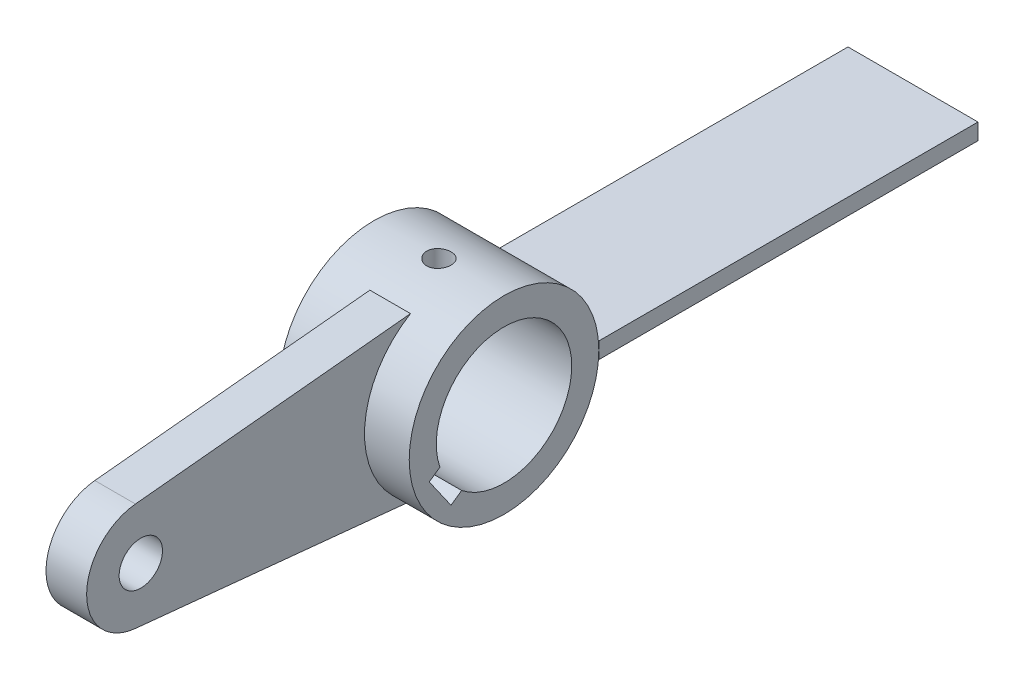
ISO-10303-21;
HEADER;
FILE_DESCRIPTION(('STEP AP214'),'2;1');
FILE_NAME('part.step','',(''),(''),'','','');
FILE_SCHEMA(('AUTOMOTIVE_DESIGN { 1 0 10303 214 1 1 1 1 }'));
ENDSEC;
DATA;
#1=APPLICATION_CONTEXT('core data for automotive mechanical design processes');
#2=APPLICATION_PROTOCOL_DEFINITION('international standard','automotive_design',2000,#1);
#3=PRODUCT_CONTEXT('',#1,'mechanical');
#4=PRODUCT('Part','Part','',(#3));
#5=PRODUCT_RELATED_PRODUCT_CATEGORY('part','',(#4));
#6=PRODUCT_DEFINITION_FORMATION('','',#4);
#7=PRODUCT_DEFINITION_CONTEXT('part definition',#1,'design');
#8=PRODUCT_DEFINITION('design','',#6,#7);
#9=PRODUCT_DEFINITION_SHAPE('','',#8);
#10=(LENGTH_UNIT() NAMED_UNIT(*) SI_UNIT(.MILLI.,.METRE.));
#11=(NAMED_UNIT(*) PLANE_ANGLE_UNIT() SI_UNIT($,.RADIAN.));
#12=(NAMED_UNIT(*) SI_UNIT($,.STERADIAN.) SOLID_ANGLE_UNIT());
#13=UNCERTAINTY_MEASURE_WITH_UNIT(LENGTH_MEASURE(1.E-05),#10,'distance_accuracy_value','');
#14=(GEOMETRIC_REPRESENTATION_CONTEXT(3) GLOBAL_UNCERTAINTY_ASSIGNED_CONTEXT((#13)) GLOBAL_UNIT_ASSIGNED_CONTEXT((#10,
#11,#12)) REPRESENTATION_CONTEXT('',''));
#15=CARTESIAN_POINT('',(0.,0.,0.));
#16=DIRECTION('',(0.,0.,1.));
#17=DIRECTION('',(1.,0.,0.));
#18=AXIS2_PLACEMENT_3D('',#15,#16,#17);
#19=CARTESIAN_POINT('',(23.9999999999994,-3.00000000000006,-175.));
#20=DIRECTION('',(1.,0.,0.));
#21=DIRECTION('',(0.,0.,-1.));
#22=AXIS2_PLACEMENT_3D('',#19,#20,#21);
#23=PLANE('',#22);
#24=DIRECTION('',(0.,1.,0.));
#25=VECTOR('',#24,1.);
#26=CARTESIAN_POINT('',(24.,-2.99999999999995,-35.0000000000001));
#27=LINE('',#26,#25);
#28=CARTESIAN_POINT('',(24.,-2.99999999999995,-35.0000000000001));
#29=VERTEX_POINT('',#28);
#30=CARTESIAN_POINT('',(24.,3.00000000000006,-35.0000000000001));
#31=VERTEX_POINT('',#30);
#32=EDGE_CURVE('E117',#29,#31,#27,.T.);
#33=ORIENTED_EDGE('',*,*,#32,.F.);
#34=DIRECTION('',(0.,0.,1.));
#35=VECTOR('',#34,1.);
#36=CARTESIAN_POINT('',(23.9999999999994,-3.00000000000006,-175.));
#37=LINE('',#36,#35);
#38=CARTESIAN_POINT('',(23.9999999999994,-3.00000000000006,-175.));
#39=VERTEX_POINT('',#38);
#40=EDGE_CURVE('E12',#39,#29,#37,.T.);
#41=ORIENTED_EDGE('',*,*,#40,.F.);
#42=DIRECTION('',(0.,1.,0.));
#43=VECTOR('',#42,1.);
#44=CARTESIAN_POINT('',(23.9999999999994,-3.00000000000006,-175.));
#45=LINE('',#44,#43);
#46=CARTESIAN_POINT('',(23.9999999999994,3.00000000000006,-175.));
#47=VERTEX_POINT('',#46);
#48=EDGE_CURVE('E111',#39,#47,#45,.T.);
#49=ORIENTED_EDGE('',*,*,#48,.T.);
#50=DIRECTION('',(0.,0.,1.));
#51=VECTOR('',#50,1.);
#52=CARTESIAN_POINT('',(23.9999999999994,3.00000000000006,-175.));
#53=LINE('',#52,#51);
#54=EDGE_CURVE('E56',#47,#31,#53,.T.);
#55=ORIENTED_EDGE('',*,*,#54,.T.);
#56=EDGE_LOOP('',(#33,#41,#49,#55));
#57=FACE_BOUND('',#56,.T.);
#58=ADVANCED_FACE('F53',(#57),#23,.T.);
#59=CARTESIAN_POINT('',(-24.0000000000007,-2.99999999999995,-175.));
#60=DIRECTION('',(0.,-1.,0.));
#61=DIRECTION('',(0.,0.,-1.));
#62=AXIS2_PLACEMENT_3D('',#59,#60,#61);
#63=PLANE('',#62);
#64=DIRECTION('',(1.,0.,0.));
#65=VECTOR('',#64,1.);
#66=CARTESIAN_POINT('',(-24.,-2.99999999999984,-35.));
#67=LINE('',#66,#65);
#68=CARTESIAN_POINT('',(-24.,-2.99999999999984,-35.));
#69=VERTEX_POINT('',#68);
#70=EDGE_CURVE('E113',#69,#29,#67,.T.);
#71=ORIENTED_EDGE('',*,*,#70,.F.);
#72=DIRECTION('',(0.,0.,1.));
#73=VECTOR('',#72,1.);
#74=CARTESIAN_POINT('',(-24.0000000000007,-2.99999999999995,-175.));
#75=LINE('',#74,#73);
#76=CARTESIAN_POINT('',(-24.0000000000007,-2.99999999999995,-175.));
#77=VERTEX_POINT('',#76);
#78=EDGE_CURVE('E62',#77,#69,#75,.T.);
#79=ORIENTED_EDGE('',*,*,#78,.F.);
#80=DIRECTION('',(1.,0.,0.));
#81=VECTOR('',#80,1.);
#82=CARTESIAN_POINT('',(-24.0000000000007,-2.99999999999995,-175.));
#83=LINE('',#82,#81);
#84=EDGE_CURVE('E108',#77,#39,#83,.T.);
#85=ORIENTED_EDGE('',*,*,#84,.T.);
#86=ORIENTED_EDGE('',*,*,#40,.T.);
#87=EDGE_LOOP('',(#71,#79,#85,#86));
#88=FACE_BOUND('',#87,.T.);
#89=ADVANCED_FACE('F127',(#88),#63,.T.);
#90=CARTESIAN_POINT('',(-24.0000000000007,-2.99999999999995,-175.));
#91=DIRECTION('',(-1.,0.,0.));
#92=DIRECTION('',(0.,0.,1.));
#93=AXIS2_PLACEMENT_3D('',#90,#91,#92);
#94=PLANE('',#93);
#95=DIRECTION('',(0.,-1.,0.));
#96=VECTOR('',#95,1.);
#97=CARTESIAN_POINT('',(-24.,-2.99999999999984,-35.));
#98=LINE('',#97,#96);
#99=CARTESIAN_POINT('',(-24.,3.00000000000017,-35.));
#100=VERTEX_POINT('',#99);
#101=EDGE_CURVE('E103',#100,#69,#98,.T.);
#102=ORIENTED_EDGE('',*,*,#101,.F.);
#103=DIRECTION('',(0.,0.,1.));
#104=VECTOR('',#103,1.);
#105=CARTESIAN_POINT('',(-24.0000000000007,3.00000000000022,-175.));
#106=LINE('',#105,#104);
#107=CARTESIAN_POINT('',(-24.0000000000007,3.00000000000022,-175.));
#108=VERTEX_POINT('',#107);
#109=EDGE_CURVE('E98',#108,#100,#106,.T.);
#110=ORIENTED_EDGE('',*,*,#109,.F.);
#111=DIRECTION('',(0.,-1.,0.));
#112=VECTOR('',#111,1.);
#113=CARTESIAN_POINT('',(-24.0000000000007,-2.99999999999995,-175.));
#114=LINE('',#113,#112);
#115=EDGE_CURVE('E101',#108,#77,#114,.T.);
#116=ORIENTED_EDGE('',*,*,#115,.T.);
#117=ORIENTED_EDGE('',*,*,#78,.T.);
#118=EDGE_LOOP('',(#102,#110,#116,#117));
#119=FACE_BOUND('',#118,.T.);
#120=ADVANCED_FACE('F100',(#119),#94,.T.);
#121=CARTESIAN_POINT('',(-24.0000000000007,3.00000000000022,-175.));
#122=DIRECTION('',(0.,1.,0.));
#123=DIRECTION('',(0.,0.,1.));
#124=AXIS2_PLACEMENT_3D('',#121,#122,#123);
#125=PLANE('',#124);
#126=DIRECTION('',(-1.,0.,0.));
#127=VECTOR('',#126,1.);
#128=CARTESIAN_POINT('',(-24.,3.00000000000017,-35.));
#129=LINE('',#128,#127);
#130=EDGE_CURVE('E120',#31,#100,#129,.T.);
#131=ORIENTED_EDGE('',*,*,#130,.F.);
#132=ORIENTED_EDGE('',*,*,#54,.F.);
#133=DIRECTION('',(-1.,0.,0.));
#134=VECTOR('',#133,1.);
#135=CARTESIAN_POINT('',(-24.0000000000007,3.00000000000022,-175.));
#136=LINE('',#135,#134);
#137=EDGE_CURVE('E107',#47,#108,#136,.T.);
#138=ORIENTED_EDGE('',*,*,#137,.T.);
#139=ORIENTED_EDGE('',*,*,#109,.T.);
#140=EDGE_LOOP('',(#131,#132,#138,#139));
#141=FACE_BOUND('',#140,.T.);
#142=ADVANCED_FACE('F110',(#141),#125,.T.);
#143=CARTESIAN_POINT('',(-6.66133814775094E-13,1.11022302462516E-13,-175.));
#144=DIRECTION('',(0.,0.,-1.));
#145=DIRECTION('',(-1.,0.,0.));
#146=AXIS2_PLACEMENT_3D('',#143,#144,#145);
#147=PLANE('',#146);
#148=ORIENTED_EDGE('',*,*,#48,.F.);
#149=ORIENTED_EDGE('',*,*,#84,.F.);
#150=ORIENTED_EDGE('',*,*,#115,.F.);
#151=ORIENTED_EDGE('',*,*,#137,.F.);
#152=EDGE_LOOP('',(#148,#149,#150,#151));
#153=FACE_BOUND('',#152,.T.);
#154=ADVANCED_FACE('F106',(#153),#147,.T.);
#155=CARTESIAN_POINT('',(0.,0.,-35.));
#156=DIRECTION('',(0.,0.,-1.));
#157=DIRECTION('',(-1.,0.,0.));
#158=AXIS2_PLACEMENT_3D('',#155,#156,#157);
#159=PLANE('',#158);
#160=ORIENTED_EDGE('',*,*,#32,.T.);
#161=ORIENTED_EDGE('',*,*,#130,.T.);
#162=ORIENTED_EDGE('',*,*,#101,.T.);
#163=ORIENTED_EDGE('',*,*,#70,.T.);
#164=EDGE_LOOP('',(#160,#161,#162,#163));
#165=FACE_BOUND('',#164,.T.);
#166=ADVANCED_FACE('F126',(#165),#159,.F.);
#167=CLOSED_SHELL('',(#58,#89,#120,#142,#154,#166));
#168=MANIFOLD_SOLID_BREP('B2',#167);
#169=CARTESIAN_POINT('',(24.,0.,0.));
#170=DIRECTION('',(-1.,0.,0.));
#171=DIRECTION('',(0.,0.,1.));
#172=AXIS2_PLACEMENT_3D('',#169,#170,#171);
#173=CYLINDRICAL_SURFACE('',#172,35.);
#174=DIRECTION('',(-1.,0.,0.));
#175=VECTOR('',#174,1.);
#176=CARTESIAN_POINT('',(7.4999999999994,30.0000000000001,18.02775637732));
#177=LINE('',#176,#175);
#178=CARTESIAN_POINT('',(7.4999999999994,30.0000000000001,18.02775637732));
#179=VERTEX_POINT('',#178);
#180=CARTESIAN_POINT('',(-7.50000000000051,30.,18.02775637732));
#181=VERTEX_POINT('',#180);
#182=EDGE_CURVE('E200',#179,#181,#177,.T.);
#183=ORIENTED_EDGE('',*,*,#182,.F.);
#184=CARTESIAN_POINT('',(7.50000000000006,1.66533453693773E-13,0.));
#185=DIRECTION('',(-1.,0.,0.));
#186=DIRECTION('',(0.,0.,-1.));
#187=AXIS2_PLACEMENT_3D('',#184,#185,#186);
#188=CIRCLE('',#187,35.);
#189=CARTESIAN_POINT('',(7.50000000000006,-29.9999999999999,18.02775637732));
#190=VERTEX_POINT('',#189);
#191=EDGE_CURVE('E282',#190,#179,#188,.T.);
#192=ORIENTED_EDGE('',*,*,#191,.F.);
#193=DIRECTION('',(-1.,0.,0.));
#194=VECTOR('',#193,1.);
#195=CARTESIAN_POINT('',(7.50000000000006,-29.9999999999999,18.02775637732));
#196=LINE('',#195,#194);
#197=CARTESIAN_POINT('',(-7.50000000000006,-30.,18.02775637732));
#198=VERTEX_POINT('',#197);
#199=EDGE_CURVE('E293',#190,#198,#196,.T.);
#200=ORIENTED_EDGE('',*,*,#199,.T.);
#201=CARTESIAN_POINT('',(-7.50000000000006,0.,0.));
#202=DIRECTION('',(-1.,0.,0.));
#203=DIRECTION('',(0.,0.,-1.));
#204=AXIS2_PLACEMENT_3D('',#201,#202,#203);
#205=CIRCLE('',#204,35.);
#206=EDGE_CURVE('E279',#198,#181,#205,.T.);
#207=ORIENTED_EDGE('',*,*,#206,.T.);
#208=EDGE_LOOP('',(#183,#192,#200,#207));
#209=FACE_BOUND('',#208,.T.);
#210=CARTESIAN_POINT('',(24.,0.,0.));
#211=DIRECTION('',(1.,0.,0.));
#212=DIRECTION('',(0.,0.,-1.));
#213=AXIS2_PLACEMENT_3D('',#210,#211,#212);
#214=CIRCLE('',#213,35.);
#215=CARTESIAN_POINT('',(24.,0.,-35.0000000000001));
#216=VERTEX_POINT('',#215);
#217=EDGE_CURVE('E314',#216,#216,#214,.T.);
#218=ORIENTED_EDGE('',*,*,#217,.F.);
#219=EDGE_LOOP('',(#218));
#220=FACE_BOUND('',#219,.T.);
#221=CARTESIAN_POINT('',(-24.,1.66533453693773E-13,0.));
#222=DIRECTION('',(1.,0.,0.));
#223=DIRECTION('',(0.,0.,-1.));
#224=AXIS2_PLACEMENT_3D('',#221,#222,#223);
#225=CIRCLE('',#224,35.);
#226=CARTESIAN_POINT('',(-24.,1.66533453693773E-13,-35.));
#227=VERTEX_POINT('',#226);
#228=EDGE_CURVE('E312',#227,#227,#225,.T.);
#229=ORIENTED_EDGE('',*,*,#228,.T.);
#230=EDGE_LOOP('',(#229));
#231=FACE_BOUND('',#230,.T.);
#232=CARTESIAN_POINT('',(-6.66133814775094E-13,34.7095087836173,4.5));
#233=CARTESIAN_POINT('',(0.251643636090625,34.7095124877344,4.49998933777102));
#234=CARTESIAN_POINT('',(0.503443077474984,34.7122749605346,4.47882058020246));
#235=CARTESIAN_POINT('',(1.00003007432827,34.7230217636267,4.39471133680819));
#236=CARTESIAN_POINT('',(1.24481009276557,34.7310115025031,4.33172758455312));
#237=CARTESIAN_POINT('',(1.72009682218295,34.751293244912,4.16587955190423));
#238=CARTESIAN_POINT('',(1.95061326011699,34.763582277653,4.0630428044678));
#239=CARTESIAN_POINT('',(2.39107558505762,34.7910743749605,3.82046770600752));
#240=CARTESIAN_POINT('',(2.60102488982105,34.806276954121,3.68073550042055));
#241=CARTESIAN_POINT('',(2.99567636291578,34.8379838512426,3.36745127394802));
#242=CARTESIAN_POINT('',(3.18023930111814,34.8544946215607,3.19372449492416));
#243=CARTESIAN_POINT('',(3.51767577864074,34.8868995891629,2.81775898128223));
#244=CARTESIAN_POINT('',(3.6705477202417,34.9027937553277,2.61551881000876));
#245=CARTESIAN_POINT('',(3.94076422813274,34.9322409256545,2.18738980575501));
#246=CARTESIAN_POINT('',(4.0579824668723,34.9457855337381,1.96142061365214));
#247=CARTESIAN_POINT('',(4.25275483563916,34.9689364819365,1.49280078764115));
#248=CARTESIAN_POINT('',(4.33031051955293,34.9785429763345,1.25015080767001));
#249=CARTESIAN_POINT('',(4.44313938142863,34.9926898511317,0.756482894207572));
#250=CARTESIAN_POINT('',(4.4786443093496,34.9972579892166,0.505518735850713));
#251=CARTESIAN_POINT('',(4.5070822128208,35.000908280569,0.00115558674675369));
#252=CARTESIAN_POINT('',(4.50001695462321,34.9999906614424,-0.252243302546962));
#253=CARTESIAN_POINT('',(4.44370039491123,34.9927952507115,-0.752705518540987));
#254=CARTESIAN_POINT('',(4.39469834536865,34.9865491298378,-0.99979741282101));
#255=CARTESIAN_POINT('',(4.25628903626044,34.9694340502021,-1.48222138707858));
#256=CARTESIAN_POINT('',(4.16688097118349,34.9585649992804,-1.71755323251062));
#257=CARTESIAN_POINT('',(3.94993384973346,34.9333707519744,-2.17054626252867));
#258=CARTESIAN_POINT('',(3.82228731667609,34.9190358363015,-2.38815541193442));
#259=CARTESIAN_POINT('',(3.5325648956177,34.8885128321251,-2.79895832654752));
#260=CARTESIAN_POINT('',(3.37048733750206,34.8723246537447,-2.99215090667714));
#261=CARTESIAN_POINT('',(3.01510860748028,34.8397678053744,-3.35010166443993));
#262=CARTESIAN_POINT('',(2.82159015519892,34.8233986766441,-3.51464415621447));
#263=CARTESIAN_POINT('',(2.40956823260544,34.7924401686365,-3.80894662438671));
#264=CARTESIAN_POINT('',(2.19106467556594,34.7778507955373,-3.93870648004295));
#265=CARTESIAN_POINT('',(1.73507857670701,34.7521039066556,-4.15977480797883));
#266=CARTESIAN_POINT('',(1.49758725017837,34.7409479910758,-4.25106535848775));
#267=CARTESIAN_POINT('',(1.01046988334868,34.723361914767,-4.39240902486836));
#268=CARTESIAN_POINT('',(0.760844463691731,34.7169315126043,-4.44246424753146));
#269=CARTESIAN_POINT('',(0.258451637424158,34.7095689114816,-4.49962939456028));
#270=CARTESIAN_POINT('',(0.0057193507413754,34.7085978151508,-4.50704314675265));
#271=CARTESIAN_POINT('',(-0.497383703992221,34.7121608523481,-4.4795171609428));
#272=CARTESIAN_POINT('',(-0.747754525244035,34.7166948615528,-4.44457837940055));
#273=CARTESIAN_POINT('',(-1.23811298962485,34.7307217162668,-4.33359517714728));
#274=CARTESIAN_POINT('',(-1.47813461083547,34.7401967422256,-4.25769843538306));
#275=CARTESIAN_POINT('',(-1.94204544180665,34.763023554883,-4.06710597120523));
#276=CARTESIAN_POINT('',(-2.16593405341176,34.7763754852313,-3.95240881110503));
#277=CARTESIAN_POINT('',(-2.59259643830436,34.8055446541734,-3.68672657963711));
#278=CARTESIAN_POINT('',(-2.79524542665446,34.8213752327748,-3.53554260327862));
#279=CARTESIAN_POINT('',(-3.17240162906183,34.8536763381778,-3.20145885277014));
#280=CARTESIAN_POINT('',(-3.34690768311404,34.8701468913235,-3.01855777193823));
#281=CARTESIAN_POINT('',(-3.66389487563753,34.9019918946263,-2.62490302263358));
#282=CARTESIAN_POINT('',(-3.8061761408599,34.9173591205467,-2.41398773958574));
#283=CARTESIAN_POINT('',(-4.05329066346264,34.9451574278269,-1.97107572083707));
#284=CARTESIAN_POINT('',(-4.15812471282887,34.9575885712812,-1.73907943111691));
#285=CARTESIAN_POINT('',(-4.32704029695663,34.9780820514106,-1.26124976561015));
#286=CARTESIAN_POINT('',(-4.39123651734144,34.9861566731867,-1.01545748061412));
#287=CARTESIAN_POINT('',(-4.47742699962901,34.9970784091068,-0.516471833488165));
#288=CARTESIAN_POINT('',(-4.4994232805437,34.9999257733433,-0.263278826026522));
#289=CARTESIAN_POINT('',(-4.50055023770882,35.0000708213091,0.241371193939387));
#290=CARTESIAN_POINT('',(-4.47998878930908,34.9974083647533,0.492827562855925));
#291=CARTESIAN_POINT('',(-4.39723705365125,34.9869122983035,0.988678877591743));
#292=CARTESIAN_POINT('',(-4.33504680731466,34.9790786934927,1.23307383035222));
#293=CARTESIAN_POINT('',(-4.17090121997438,34.9591165349092,1.70781857898461));
#294=CARTESIAN_POINT('',(-4.06896151004324,34.94698966959,1.93817385469418));
#295=CARTESIAN_POINT('',(-3.82824263239111,34.919782356141,2.37855716922592));
#296=CARTESIAN_POINT('',(-3.68946292425321,34.9047018646846,2.58858490979574));
#297=CARTESIAN_POINT('',(-3.37786758604742,34.8731396060274,2.98392282812855));
#298=CARTESIAN_POINT('',(-3.20482304755,34.8566488632015,3.16905188094121));
#299=CARTESIAN_POINT('',(-2.8300871396523,34.8241960011506,3.50776315561487));
#300=CARTESIAN_POINT('',(-2.62838900530544,34.8082340078608,3.66133790668347));
#301=CARTESIAN_POINT('',(-2.20112243609521,34.7785763827015,3.93312194718525));
#302=CARTESIAN_POINT('',(-1.97545987664799,34.7648902731431,4.05118423861822));
#303=CARTESIAN_POINT('',(-1.50745850079911,34.7414455531369,4.24756746260808));
#304=CARTESIAN_POINT('',(-1.26513803653902,34.7316826991112,4.32593135887034));
#305=CARTESIAN_POINT('',(-0.851320095922502,34.7195453607448,4.42205994739743));
#306=CARTESIAN_POINT('',(-0.682426299612195,34.7158005455426,4.45124508889983));
#307=CARTESIAN_POINT('',(-0.342379034908585,34.7107810069286,4.49021866298948));
#308=CARTESIAN_POINT('',(-0.171225585086303,34.7095062632292,4.500007254888));
#309=CARTESIAN_POINT('',(-6.66133814775094E-13,34.7095087836173,4.5));
#310=B_SPLINE_CURVE_WITH_KNOTS('',3,(#232,#233,#234,#235,#236,#237,#238,#239,#240,#241,#242,
#243,#244,#245,#246,#247,#248,#249,#250,#251,#252,#253,#254,#255,#256,#257,#258,#259,#260,#261,
#262,#263,#264,#265,#266,#267,#268,#269,#270,#271,#272,#273,#274,#275,#276,#277,#278,#279,#280,
#281,#282,#283,#284,#285,#286,#287,#288,#289,#290,#291,#292,#293,#294,#295,#296,#297,#298,#299,
#300,#301,#302,#303,#304,#305,#306,#307,#308,#309),.UNSPECIFIED.,.T.,.F.,(4,2,2,2,2,2,2,2,2,2,2,
2,2,2,2,2,2,2,2,2,2,2,2,2,2,2,2,2,2,2,2,2,2,2,2,2,2,2,4),(0.,0.754305350612478,1.50939240812154,
2.2639587312712,3.01839945040449,3.77682559976821,4.5352899763157,5.29641123827629,
6.05750267899479,6.81437978269765,7.57122548351597,8.32360385422265,9.07599722457793,
9.83052550826442,10.5850903995328,11.3451109494191,12.1051341375413,12.865511008757,
13.6258490284608,14.3807627323328,15.1356593880798,15.8878521818429,16.6400728499435,
17.3964906881089,18.1529396965983,18.9139593524325,19.6749629122101,20.4338091250724,
21.1926190308266,21.9459586698084,22.6992975682511,23.4523405221012,24.2053945231731,
24.9636602561153,25.7221053096082,26.4836479349861,27.2443646083792,27.7576199317478,
28.2708710395366),.UNSPECIFIED.);
#311=CARTESIAN_POINT('',(-6.66133814775094E-13,34.7095087836173,4.5));
#312=VERTEX_POINT('',#311);
#313=EDGE_CURVE('E266',#312,#312,#310,.T.);
#314=ORIENTED_EDGE('',*,*,#313,.F.);
#315=EDGE_LOOP('',(#314));
#316=FACE_BOUND('',#315,.T.);
#317=ADVANCED_FACE('F171',(#209,#220,#231,#316),#173,.T.);
#318=CARTESIAN_POINT('',(24.,0.,0.));
#319=DIRECTION('',(-1.,0.,0.));
#320=DIRECTION('',(0.,0.,1.));
#321=AXIS2_PLACEMENT_3D('',#318,#319,#320);
#322=CYLINDRICAL_SURFACE('',#321,25.);
#323=DIRECTION('',(-1.,0.,0.));
#324=VECTOR('',#323,1.);
#325=CARTESIAN_POINT('',(24.,-19.4998987824481,15.6446140084784));
#326=LINE('',#325,#324);
#327=CARTESIAN_POINT('',(24.,-19.4998987824481,15.6446140084784));
#328=VERTEX_POINT('',#327);
#329=CARTESIAN_POINT('',(-24.,-19.4998987824481,15.6446140084784));
#330=VERTEX_POINT('',#329);
#331=EDGE_CURVE('E51',#328,#330,#326,.T.);
#332=ORIENTED_EDGE('',*,*,#331,.F.);
#333=CARTESIAN_POINT('',(24.,0.,0.));
#334=DIRECTION('',(1.,0.,0.));
#335=DIRECTION('',(0.,0.,-1.));
#336=AXIS2_PLACEMENT_3D('',#333,#334,#335);
#337=CIRCLE('',#336,25.);
#338=CARTESIAN_POINT('',(24.,-8.03177016240214,23.6746841173931));
#339=VERTEX_POINT('',#338);
#340=EDGE_CURVE('E309',#328,#339,#337,.T.);
#341=ORIENTED_EDGE('',*,*,#340,.T.);
#342=DIRECTION('',(-1.,0.,0.));
#343=VECTOR('',#342,1.);
#344=CARTESIAN_POINT('',(24.,-8.03177016240214,23.6746841173931));
#345=LINE('',#344,#343);
#346=CARTESIAN_POINT('',(-24.,-8.03177016240209,23.6746841173932));
#347=VERTEX_POINT('',#346);
#348=EDGE_CURVE('E185',#347,#339,#345,.F.);
#349=ORIENTED_EDGE('',*,*,#348,.F.);
#350=CARTESIAN_POINT('',(-24.,1.66533453693773E-13,0.));
#351=DIRECTION('',(1.,0.,0.));
#352=DIRECTION('',(0.,0.,-1.));
#353=AXIS2_PLACEMENT_3D('',#350,#351,#352);
#354=CIRCLE('',#353,25.);
#355=EDGE_CURVE('E260',#330,#347,#354,.T.);
#356=ORIENTED_EDGE('',*,*,#355,.F.);
#357=EDGE_LOOP('',(#332,#341,#349,#356));
#358=FACE_BOUND('',#357,.T.);
#359=CARTESIAN_POINT('',(-6.66133814775094E-13,24.5916652547159,4.5));
#360=CARTESIAN_POINT('',(0.250560292538914,24.5916700002208,4.49999020787904));
#361=CARTESIAN_POINT('',(0.501249820346736,24.5955361825569,4.47900222636962));
#362=CARTESIAN_POINT('',(0.995573090360931,24.610565863383,4.39565389791443));
#363=CARTESIAN_POINT('',(1.23920045759794,24.621735753036,4.33325731535193));
#364=CARTESIAN_POINT('',(1.71217490039245,24.6500677101136,4.16905904972013));
#365=CARTESIAN_POINT('',(1.94153455383635,24.667224408989,4.0672926618672));
#366=CARTESIAN_POINT('',(2.37990652145238,24.7055905096529,3.82733507034742));
#367=CARTESIAN_POINT('',(2.58892068142907,24.726799543283,3.68914717517487));
#368=CARTESIAN_POINT('',(2.98308664653375,24.7711525389446,3.3785781188327));
#369=CARTESIAN_POINT('',(3.16797101679898,24.794314152916,3.2058600080791));
#370=CARTESIAN_POINT('',(3.5063017993888,24.8398063454844,2.83186161317135));
#371=CARTESIAN_POINT('',(3.6597462244156,24.8621368714758,2.63057952486766));
#372=CARTESIAN_POINT('',(3.93185852774548,24.9036391293373,2.20341884816339));
#373=CARTESIAN_POINT('',(4.05027543880928,24.9227876542649,1.97737793963205));
#374=CARTESIAN_POINT('',(4.24735581413198,24.9555712244353,1.50820889649411));
#375=CARTESIAN_POINT('',(4.32602229054242,24.9692066874234,1.26508205819146));
#376=CARTESIAN_POINT('',(4.4405450505499,24.9893031295679,0.771411136896947));
#377=CARTESIAN_POINT('',(4.47685166080907,24.9958395261317,0.520974642176892));
#378=CARTESIAN_POINT('',(4.50702617412045,25.0012609993543,0.0174852436274991));
#379=CARTESIAN_POINT('',(4.50089741924658,25.0001466785593,-0.235567452590823));
#380=CARTESIAN_POINT('',(4.44672271660606,24.9904514916907,-0.734021195457856));
#381=CARTESIAN_POINT('',(4.39916156254196,24.9819569830361,-0.979476853601246));
#382=CARTESIAN_POINT('',(4.26423763322059,24.9585524820728,-1.45886569316236));
#383=CARTESIAN_POINT('',(4.17687349325351,24.9436422697923,-1.69279847919499));
#384=CARTESIAN_POINT('',(3.96435424405114,24.9089362923466,-2.14392052086346));
#385=CARTESIAN_POINT('',(3.83900312142696,24.8891152865838,-2.36101541541657));
#386=CARTESIAN_POINT('',(3.55421227446883,24.846783558396,-2.7712712204049));
#387=CARTESIAN_POINT('',(3.39476934602692,24.8242725832429,-2.96442987850311));
#388=CARTESIAN_POINT('',(3.04364282550235,24.7786824428208,-3.32419962120039));
#389=CARTESIAN_POINT('',(2.85153523645629,24.7555997441616,-3.4903967112005));
#390=CARTESIAN_POINT('',(2.44195103212937,24.7117733103908,-3.78827096388227));
#391=CARTESIAN_POINT('',(2.22447410087657,24.6910296044174,-3.91994769655092));
#392=CARTESIAN_POINT('',(1.76980144211362,24.6542258637708,-4.14514765312471));
#393=CARTESIAN_POINT('',(1.53257723305964,24.638172750181,-4.23861457781455));
#394=CARTESIAN_POINT('',(1.04543970286983,24.612676698828,-4.38425203841366));
#395=CARTESIAN_POINT('',(0.795527701464493,24.6032330750785,-4.4364268600259));
#396=CARTESIAN_POINT('',(0.293831017771802,24.5921598987445,-4.49740266533614));
#397=CARTESIAN_POINT('',(0.0421207011170441,24.5904235124834,-4.50679670168347));
#398=CARTESIAN_POINT('',(-0.459273109632522,24.5946760229544,-4.48353053755113));
#399=CARTESIAN_POINT('',(-0.708956695185496,24.6006645691193,-4.45087224545902));
#400=CARTESIAN_POINT('',(-1.19728439916295,24.6195929732222,-4.34493631837004));
#401=CARTESIAN_POINT('',(-1.43599745304174,24.6324801815451,-4.27196620425242));
#402=CARTESIAN_POINT('',(-1.89780834752,24.6637089326836,-4.08780286466608));
#403=CARTESIAN_POINT('',(-2.1209051154569,24.6820508497229,-3.97660701661588));
#404=CARTESIAN_POINT('',(-2.54777321056009,24.7223674833291,-3.71777078436197));
#405=CARTESIAN_POINT('',(-2.75131261458557,24.7443789168986,-3.56975374196588));
#406=CARTESIAN_POINT('',(-3.13087862102193,24.789449662653,-3.24198805212373));
#407=CARTESIAN_POINT('',(-3.30690294963411,24.8125090612369,-3.06223678482665));
#408=CARTESIAN_POINT('',(-3.6286390613489,24.8574188391545,-2.6734642376788));
#409=CARTESIAN_POINT('',(-3.77395322900307,24.8792509542031,-2.4641114659437));
#410=CARTESIAN_POINT('',(-4.02734580121208,24.9189444607154,-2.02361997006648));
#411=CARTESIAN_POINT('',(-4.13542555802882,24.9368059963723,-1.792482037496));
#412=CARTESIAN_POINT('',(-4.31067727410643,24.9664669754971,-1.31611066519809));
#413=CARTESIAN_POINT('',(-4.37804925296256,24.978296014407,-1.07095273334426));
#414=CARTESIAN_POINT('',(-4.47061359601432,24.9946850276111,-0.572569638816892));
#415=CARTESIAN_POINT('',(-4.49581003553646,24.9992457042286,-0.319345257995826));
#416=CARTESIAN_POINT('',(-4.50317533250132,25.0005716694734,0.184160473596217));
#417=CARTESIAN_POINT('',(-4.48594635226305,24.9974460538192,0.43443292963253));
#418=CARTESIAN_POINT('',(-4.41026259778506,24.9839758315693,0.928456030303538));
#419=CARTESIAN_POINT('',(-4.35180815397363,24.9736312828346,1.17220672719486));
#420=CARTESIAN_POINT('',(-4.19557826338839,24.9468836827138,1.64598161778445));
#421=CARTESIAN_POINT('',(-4.09786214147656,24.9304897750177,1.87602592248967));
#422=CARTESIAN_POINT('',(-3.86595284085605,24.8934236511619,2.31654499861619));
#423=CARTESIAN_POINT('',(-3.73175747875106,24.8727511789344,2.52701859765742));
#424=CARTESIAN_POINT('',(-3.42860296478708,24.8290672923682,2.92543490433517));
#425=CARTESIAN_POINT('',(-3.25920648779198,24.8060285011722,3.11304188804685));
#426=CARTESIAN_POINT('',(-2.89137015490466,24.7603874785504,3.4573771978208));
#427=CARTESIAN_POINT('',(-2.69292349422242,24.7377853508177,3.6140982688511));
#428=CARTESIAN_POINT('',(-2.27062571053899,24.6953697013823,3.89344354010077));
#429=CARTESIAN_POINT('',(-2.04657476935427,24.6755812595325,4.01576956407123));
#430=CARTESIAN_POINT('',(-1.58082601766809,24.6413330406692,4.22085375605177));
#431=CARTESIAN_POINT('',(-1.33914549042428,24.6268681266407,4.30365009186588));
#432=CARTESIAN_POINT('',(-0.913885909985189,24.6079930223582,4.41006364176241));
#433=CARTESIAN_POINT('',(-0.732830108031937,24.6019055933167,4.44373337545181));
#434=CARTESIAN_POINT('',(-0.367872716492866,24.5937400145738,4.48870488586136));
#435=CARTESIAN_POINT('',(-0.18397119408077,24.59166177038,4.50000718975927));
#436=CARTESIAN_POINT('',(-6.66133814775094E-13,24.5916652547159,4.5));
#437=B_SPLINE_CURVE_WITH_KNOTS('',3,(#359,#360,#361,#362,#363,#364,#365,#366,#367,#368,#369,
#370,#371,#372,#373,#374,#375,#376,#377,#378,#379,#380,#381,#382,#383,#384,#385,#386,#387,#388,
#389,#390,#391,#392,#393,#394,#395,#396,#397,#398,#399,#400,#401,#402,#403,#404,#405,#406,#407,
#408,#409,#410,#411,#412,#413,#414,#415,#416,#417,#418,#419,#420,#421,#422,#423,#424,#425,#426,
#427,#428,#429,#430,#431,#432,#433,#434,#435,#436),.UNSPECIFIED.,.T.,.F.,(4,2,2,2,2,2,2,2,2,2,2,
2,2,2,2,2,2,2,2,2,2,2,2,2,2,2,2,2,2,2,2,2,2,2,2,2,2,2,4),(0.,0.751007823315607,1.50267370263592,
2.25366726573973,3.00459263281708,3.76323862126778,4.52193254843776,5.28593759271684,
6.04988473462979,6.80563415908471,7.56132406380437,8.30828875907815,9.05527906717346,
9.80619145471947,10.5571744475823,11.3187761486374,12.080387336358,12.8431166898061,
13.6057668692705,14.3578118998257,15.1098228028344,15.8561746220763,16.6025776570575,
17.3569547698991,18.1113941902533,18.8750727070003,19.6387234859038,20.3985908537588,
21.1583847931172,21.9074569708067,22.6565231446384,23.4044617016957,24.1524450350689,
24.9103454896502,25.6684237617149,26.4328844262619,27.1966054671967,27.74803786343,
28.2994572628029),.UNSPECIFIED.);
#438=CARTESIAN_POINT('',(-6.66133814775094E-13,24.5916652547159,4.5));
#439=VERTEX_POINT('',#438);
#440=EDGE_CURVE('E175',#439,#439,#437,.T.);
#441=ORIENTED_EDGE('',*,*,#440,.T.);
#442=EDGE_LOOP('',(#441));
#443=FACE_BOUND('',#442,.T.);
#444=ADVANCED_FACE('F326',(#358,#443),#322,.F.);
#445=CARTESIAN_POINT('',(24.,0.,0.));
#446=DIRECTION('',(1.,0.,0.));
#447=DIRECTION('',(0.,0.,-1.));
#448=AXIS2_PLACEMENT_3D('',#445,#446,#447);
#449=PLANE('',#448);
#450=DIRECTION('',(0.,0.573576436351051,-0.81915204428899));
#451=VECTOR('',#450,1.);
#452=CARTESIAN_POINT('',(24.,-4.7226364871133,-5.45950368370912));
#453=LINE('',#452,#451);
#454=CARTESIAN_POINT('',(24.,-22.2530656769331,19.5765438210655));
#455=VERTEX_POINT('',#454);
#456=EDGE_CURVE('E261',#455,#328,#453,.T.);
#457=ORIENTED_EDGE('',*,*,#456,.F.);
#458=DIRECTION('',(0.,-0.81915204428899,-0.573576436351051));
#459=VECTOR('',#458,1.);
#460=CARTESIAN_POINT('',(24.,-10.7849370568872,27.6066139299803));
#461=LINE('',#460,#459);
#462=CARTESIAN_POINT('',(24.,-10.7849370568872,27.6066139299803));
#463=VERTEX_POINT('',#462);
#464=EDGE_CURVE('E263',#463,#455,#461,.T.);
#465=ORIENTED_EDGE('',*,*,#464,.F.);
#466=DIRECTION('',(0.,-0.573576436351051,0.819152044288989));
#467=VECTOR('',#466,1.);
#468=CARTESIAN_POINT('',(24.,6.74549213293257,2.57056642520562));
#469=LINE('',#468,#467);
#470=EDGE_CURVE('E243',#339,#463,#469,.T.);
#471=ORIENTED_EDGE('',*,*,#470,.F.);
#472=ORIENTED_EDGE('',*,*,#340,.F.);
#473=EDGE_LOOP('',(#457,#465,#471,#472));
#474=FACE_BOUND('',#473,.T.);
#475=ORIENTED_EDGE('',*,*,#217,.T.);
#476=EDGE_LOOP('',(#475));
#477=FACE_BOUND('',#476,.T.);
#478=ADVANCED_FACE('F323',(#474,#477),#449,.T.);
#479=CARTESIAN_POINT('',(-24.,1.66533453693773E-13,0.));
#480=DIRECTION('',(1.,0.,0.));
#481=DIRECTION('',(0.,0.,-1.));
#482=AXIS2_PLACEMENT_3D('',#479,#480,#481);
#483=PLANE('',#482);
#484=ORIENTED_EDGE('',*,*,#228,.F.);
#485=EDGE_LOOP('',(#484));
#486=FACE_BOUND('',#485,.T.);
#487=DIRECTION('',(0.,-0.81915204428899,-0.573576436351051));
#488=VECTOR('',#487,1.);
#489=CARTESIAN_POINT('',(-24.,-10.7849370568872,27.6066139299803));
#490=LINE('',#489,#488);
#491=CARTESIAN_POINT('',(-24.,-10.7849370568872,27.6066139299803));
#492=VERTEX_POINT('',#491);
#493=CARTESIAN_POINT('',(-24.,-22.253065676933,19.5765438210656));
#494=VERTEX_POINT('',#493);
#495=EDGE_CURVE('E251',#492,#494,#490,.T.);
#496=ORIENTED_EDGE('',*,*,#495,.T.);
#497=DIRECTION('',(0.,0.573576436351051,-0.81915204428899));
#498=VECTOR('',#497,1.);
#499=CARTESIAN_POINT('',(-24.,-4.72263648711324,-5.45950368370907));
#500=LINE('',#499,#498);
#501=EDGE_CURVE('E248',#494,#330,#500,.T.);
#502=ORIENTED_EDGE('',*,*,#501,.T.);
#503=ORIENTED_EDGE('',*,*,#355,.T.);
#504=DIRECTION('',(0.,-0.573576436351051,0.819152044288989));
#505=VECTOR('',#504,1.);
#506=CARTESIAN_POINT('',(-24.,6.74549213293263,2.57056642520562));
#507=LINE('',#506,#505);
#508=EDGE_CURVE('E192',#347,#492,#507,.T.);
#509=ORIENTED_EDGE('',*,*,#508,.T.);
#510=EDGE_LOOP('',(#496,#502,#503,#509));
#511=FACE_BOUND('',#510,.T.);
#512=ADVANCED_FACE('F258',(#486,#511),#483,.F.);
#513=CARTESIAN_POINT('',(7.4999999999994,30.0000000000001,18.02775637732));
#514=DIRECTION('',(0.,-0.995092310823553,-0.098950962298718));
#515=DIRECTION('',(0.,0.0989509622987181,-0.995092310823554));
#516=AXIS2_PLACEMENT_3D('',#513,#514,#515);
#517=PLANE('',#516);
#518=DIRECTION('',(0.,-0.098950962298718,0.995092310823553));
#519=VECTOR('',#518,1.);
#520=CARTESIAN_POINT('',(-7.50000000000051,30.,18.02775637732));
#521=LINE('',#520,#519);
#522=CARTESIAN_POINT('',(-7.50000000000006,19.9018462164712,119.579019245975));
#523=VERTEX_POINT('',#522);
#524=EDGE_CURVE('E295',#181,#523,#521,.T.);
#525=ORIENTED_EDGE('',*,*,#524,.T.);
#526=DIRECTION('',(-1.,0.,0.));
#527=VECTOR('',#526,1.);
#528=CARTESIAN_POINT('',(7.49999999999984,19.9018462164712,119.579019245975));
#529=LINE('',#528,#527);
#530=CARTESIAN_POINT('',(7.49999999999984,19.9018462164712,119.579019245975));
#531=VERTEX_POINT('',#530);
#532=EDGE_CURVE('E305',#531,#523,#529,.T.);
#533=ORIENTED_EDGE('',*,*,#532,.F.);
#534=DIRECTION('',(0.,-0.098950962298718,0.995092310823553));
#535=VECTOR('',#534,1.);
#536=CARTESIAN_POINT('',(7.4999999999994,30.0000000000001,18.02775637732));
#537=LINE('',#536,#535);
#538=EDGE_CURVE('E285',#179,#531,#537,.T.);
#539=ORIENTED_EDGE('',*,*,#538,.F.);
#540=ORIENTED_EDGE('',*,*,#182,.T.);
#541=EDGE_LOOP('',(#525,#533,#539,#540));
#542=FACE_BOUND('',#541,.T.);
#543=ADVANCED_FACE('F381',(#542),#517,.F.);
#544=CARTESIAN_POINT('',(7.4999999999994,1.11022302462516E-13,117.6));
#545=DIRECTION('',(-1.,0.,0.));
#546=DIRECTION('',(0.,0.,1.));
#547=AXIS2_PLACEMENT_3D('',#544,#545,#546);
#548=CYLINDRICAL_SURFACE('',#547,20.);
#549=CARTESIAN_POINT('',(-7.50000000000051,0.,117.6));
#550=DIRECTION('',(1.,0.,0.));
#551=DIRECTION('',(0.,0.,-1.));
#552=AXIS2_PLACEMENT_3D('',#549,#550,#551);
#553=CIRCLE('',#552,20.);
#554=CARTESIAN_POINT('',(-7.50000000000051,-19.9018462164711,119.579019245975));
#555=VERTEX_POINT('',#554);
#556=EDGE_CURVE('E297',#523,#555,#553,.T.);
#557=ORIENTED_EDGE('',*,*,#556,.T.);
#558=DIRECTION('',(-1.,0.,0.));
#559=VECTOR('',#558,1.);
#560=CARTESIAN_POINT('',(7.4999999999994,-19.901846216471,119.579019245974));
#561=LINE('',#560,#559);
#562=CARTESIAN_POINT('',(7.4999999999994,-19.901846216471,119.579019245974));
#563=VERTEX_POINT('',#562);
#564=EDGE_CURVE('E302',#563,#555,#561,.T.);
#565=ORIENTED_EDGE('',*,*,#564,.F.);
#566=CARTESIAN_POINT('',(7.4999999999994,1.11022302462516E-13,117.6));
#567=DIRECTION('',(1.,0.,0.));
#568=DIRECTION('',(0.,0.,-1.));
#569=AXIS2_PLACEMENT_3D('',#566,#567,#568);
#570=CIRCLE('',#569,20.);
#571=EDGE_CURVE('E288',#531,#563,#570,.T.);
#572=ORIENTED_EDGE('',*,*,#571,.F.);
#573=ORIENTED_EDGE('',*,*,#532,.T.);
#574=EDGE_LOOP('',(#557,#565,#572,#573));
#575=FACE_BOUND('',#574,.T.);
#576=ADVANCED_FACE('F377',(#575),#548,.T.);
#577=CARTESIAN_POINT('',(7.4999999999994,-19.901846216471,119.579019245974));
#578=DIRECTION('',(0.,0.995092310823554,-0.098950962298718));
#579=DIRECTION('',(0.,0.0989509622987181,0.995092310823554));
#580=AXIS2_PLACEMENT_3D('',#577,#578,#579);
#581=PLANE('',#580);
#582=DIRECTION('',(0.,-0.098950962298718,-0.995092310823554));
#583=VECTOR('',#582,1.);
#584=CARTESIAN_POINT('',(-7.50000000000051,-19.9018462164711,119.579019245975));
#585=LINE('',#584,#583);
#586=EDGE_CURVE('E286',#555,#198,#585,.T.);
#587=ORIENTED_EDGE('',*,*,#586,.T.);
#588=ORIENTED_EDGE('',*,*,#199,.F.);
#589=DIRECTION('',(0.,-0.098950962298718,-0.995092310823554));
#590=VECTOR('',#589,1.);
#591=CARTESIAN_POINT('',(7.4999999999994,-19.901846216471,119.579019245974));
#592=LINE('',#591,#590);
#593=EDGE_CURVE('E290',#563,#190,#592,.T.);
#594=ORIENTED_EDGE('',*,*,#593,.F.);
#595=ORIENTED_EDGE('',*,*,#564,.T.);
#596=EDGE_LOOP('',(#587,#588,#594,#595));
#597=FACE_BOUND('',#596,.T.);
#598=ADVANCED_FACE('F370',(#597),#581,.F.);
#599=CARTESIAN_POINT('',(7.50000000000006,1.66533453693773E-13,0.));
#600=DIRECTION('',(1.,0.,0.));
#601=DIRECTION('',(0.,0.,-1.));
#602=AXIS2_PLACEMENT_3D('',#599,#600,#601);
#603=PLANE('',#602);
#604=CARTESIAN_POINT('',(7.4999999999994,1.11022302462516E-13,117.6));
#605=DIRECTION('',(1.,0.,0.));
#606=DIRECTION('',(0.,0.,-1.));
#607=AXIS2_PLACEMENT_3D('',#604,#605,#606);
#608=CIRCLE('',#607,8.);
#609=CARTESIAN_POINT('',(7.4999999999994,1.11022302462516E-13,109.6));
#610=VERTEX_POINT('',#609);
#611=EDGE_CURVE('E274',#610,#610,#608,.T.);
#612=ORIENTED_EDGE('',*,*,#611,.F.);
#613=EDGE_LOOP('',(#612));
#614=FACE_BOUND('',#613,.T.);
#615=ORIENTED_EDGE('',*,*,#191,.T.);
#616=ORIENTED_EDGE('',*,*,#538,.T.);
#617=ORIENTED_EDGE('',*,*,#571,.T.);
#618=ORIENTED_EDGE('',*,*,#593,.T.);
#619=EDGE_LOOP('',(#615,#616,#617,#618));
#620=FACE_BOUND('',#619,.T.);
#621=ADVANCED_FACE('F367',(#614,#620),#603,.T.);
#622=CARTESIAN_POINT('',(-7.50000000000006,0.,0.));
#623=DIRECTION('',(1.,0.,0.));
#624=DIRECTION('',(0.,0.,-1.));
#625=AXIS2_PLACEMENT_3D('',#622,#623,#624);
#626=PLANE('',#625);
#627=CARTESIAN_POINT('',(-7.50000000000051,0.,117.6));
#628=DIRECTION('',(1.,0.,0.));
#629=DIRECTION('',(0.,0.,-1.));
#630=AXIS2_PLACEMENT_3D('',#627,#628,#629);
#631=CIRCLE('',#630,8.);
#632=CARTESIAN_POINT('',(-7.50000000000051,0.,109.6));
#633=VERTEX_POINT('',#632);
#634=EDGE_CURVE('E276',#633,#633,#631,.T.);
#635=ORIENTED_EDGE('',*,*,#634,.T.);
#636=EDGE_LOOP('',(#635));
#637=FACE_BOUND('',#636,.T.);
#638=ORIENTED_EDGE('',*,*,#206,.F.);
#639=ORIENTED_EDGE('',*,*,#586,.F.);
#640=ORIENTED_EDGE('',*,*,#556,.F.);
#641=ORIENTED_EDGE('',*,*,#524,.F.);
#642=EDGE_LOOP('',(#638,#639,#640,#641));
#643=FACE_BOUND('',#642,.T.);
#644=ADVANCED_FACE('F338',(#637,#643),#626,.F.);
#645=CARTESIAN_POINT('',(-7.50000000000051,0.,117.6));
#646=DIRECTION('',(1.,0.,0.));
#647=DIRECTION('',(0.,0.,-1.));
#648=AXIS2_PLACEMENT_3D('',#645,#646,#647);
#649=CYLINDRICAL_SURFACE('',#648,8.);
#650=ORIENTED_EDGE('',*,*,#634,.F.);
#651=EDGE_LOOP('',(#650));
#652=FACE_BOUND('',#651,.T.);
#653=ORIENTED_EDGE('',*,*,#611,.T.);
#654=EDGE_LOOP('',(#653));
#655=FACE_BOUND('',#654,.T.);
#656=ADVANCED_FACE('F331',(#652,#655),#649,.F.);
#657=CARTESIAN_POINT('',(-24.,-4.72263648711324,-5.45950368370907));
#658=DIRECTION('',(0.,-0.81915204428899,-0.573576436351051));
#659=DIRECTION('',(0.,0.573576436351051,-0.81915204428899));
#660=AXIS2_PLACEMENT_3D('',#657,#658,#659);
#661=PLANE('',#660);
#662=ORIENTED_EDGE('',*,*,#331,.T.);
#663=ORIENTED_EDGE('',*,*,#501,.F.);
#664=DIRECTION('',(1.,0.,0.));
#665=VECTOR('',#664,1.);
#666=CARTESIAN_POINT('',(-24.,-22.253065676933,19.5765438210656));
#667=LINE('',#666,#665);
#668=EDGE_CURVE('E247',#494,#455,#667,.T.);
#669=ORIENTED_EDGE('',*,*,#668,.T.);
#670=ORIENTED_EDGE('',*,*,#456,.T.);
#671=EDGE_LOOP('',(#662,#663,#669,#670));
#672=FACE_BOUND('',#671,.T.);
#673=ADVANCED_FACE('F329',(#672),#661,.F.);
#674=CARTESIAN_POINT('',(-24.,-10.7849370568872,27.6066139299803));
#675=DIRECTION('',(0.,-0.573576436351051,0.819152044288989));
#676=DIRECTION('',(0.,-0.81915204428899,-0.573576436351051));
#677=AXIS2_PLACEMENT_3D('',#674,#675,#676);
#678=PLANE('',#677);
#679=ORIENTED_EDGE('',*,*,#464,.T.);
#680=ORIENTED_EDGE('',*,*,#668,.F.);
#681=ORIENTED_EDGE('',*,*,#495,.F.);
#682=DIRECTION('',(1.,0.,0.));
#683=VECTOR('',#682,1.);
#684=CARTESIAN_POINT('',(-24.,-10.7849370568872,27.6066139299803));
#685=LINE('',#684,#683);
#686=EDGE_CURVE('E239',#492,#463,#685,.T.);
#687=ORIENTED_EDGE('',*,*,#686,.T.);
#688=EDGE_LOOP('',(#679,#680,#681,#687));
#689=FACE_BOUND('',#688,.T.);
#690=ADVANCED_FACE('F252',(#689),#678,.F.);
#691=CARTESIAN_POINT('',(-24.,6.74549213293263,2.57056642520562));
#692=DIRECTION('',(0.,0.819152044288989,0.573576436351051));
#693=DIRECTION('',(0.,-0.573576436351051,0.81915204428899));
#694=AXIS2_PLACEMENT_3D('',#691,#692,#693);
#695=PLANE('',#694);
#696=ORIENTED_EDGE('',*,*,#348,.T.);
#697=ORIENTED_EDGE('',*,*,#470,.T.);
#698=ORIENTED_EDGE('',*,*,#686,.F.);
#699=ORIENTED_EDGE('',*,*,#508,.F.);
#700=EDGE_LOOP('',(#696,#697,#698,#699));
#701=FACE_BOUND('',#700,.T.);
#702=ADVANCED_FACE('F241',(#701),#695,.F.);
#703=CARTESIAN_POINT('',(0.,11.,0.));
#704=DIRECTION('',(0.,1.,0.));
#705=DIRECTION('',(0.,0.,1.));
#706=AXIS2_PLACEMENT_3D('',#703,#704,#705);
#707=CYLINDRICAL_SURFACE('',#706,4.5);
#708=ORIENTED_EDGE('',*,*,#440,.F.);
#709=EDGE_LOOP('',(#708));
#710=FACE_BOUND('',#709,.T.);
#711=ORIENTED_EDGE('',*,*,#313,.T.);
#712=EDGE_LOOP('',(#711));
#713=FACE_BOUND('',#712,.T.);
#714=ADVANCED_FACE('F356',(#710,#713),#707,.F.);
#715=CLOSED_SHELL('',(#317,#444,#478,#512,#543,#576,#598,#621,#644,#656,#673,#690,#702,#714));
#716=MANIFOLD_SOLID_BREP('B6',#715);
#717=ADVANCED_BREP_SHAPE_REPRESENTATION('',(#18,#168,#716),#14);
#718=SHAPE_DEFINITION_REPRESENTATION(#9,#717);
ENDSEC;
END-ISO-10303-21;
